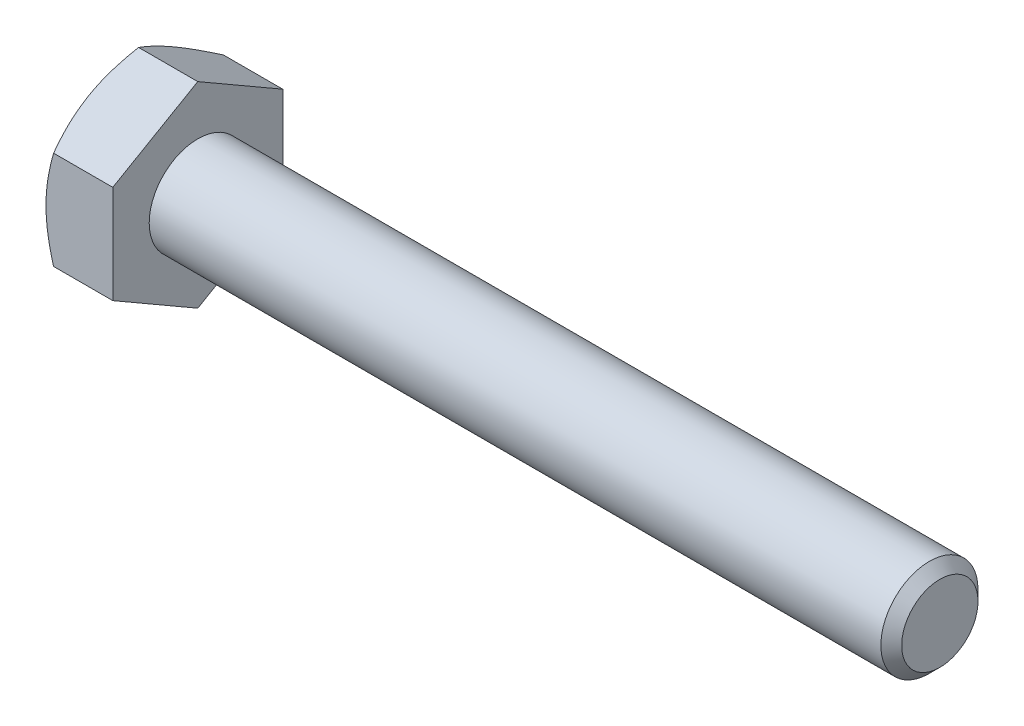
ISO-10303-21;
HEADER;
FILE_DESCRIPTION(('STEP AP214'),'2;1');
FILE_NAME('part.step','',(''),(''),'','','');
FILE_SCHEMA(('AUTOMOTIVE_DESIGN { 1 0 10303 214 1 1 1 1 }'));
ENDSEC;
DATA;
#1=APPLICATION_CONTEXT('core data for automotive mechanical design processes');
#2=APPLICATION_PROTOCOL_DEFINITION('international standard','automotive_design',2000,#1);
#3=PRODUCT_CONTEXT('',#1,'mechanical');
#4=PRODUCT('Part','Part','',(#3));
#5=PRODUCT_RELATED_PRODUCT_CATEGORY('part','',(#4));
#6=PRODUCT_DEFINITION_FORMATION('','',#4);
#7=PRODUCT_DEFINITION_CONTEXT('part definition',#1,'design');
#8=PRODUCT_DEFINITION('design','',#6,#7);
#9=PRODUCT_DEFINITION_SHAPE('','',#8);
#10=(LENGTH_UNIT() NAMED_UNIT(*) SI_UNIT(.MILLI.,.METRE.));
#11=(NAMED_UNIT(*) PLANE_ANGLE_UNIT() SI_UNIT($,.RADIAN.));
#12=(NAMED_UNIT(*) SI_UNIT($,.STERADIAN.) SOLID_ANGLE_UNIT());
#13=UNCERTAINTY_MEASURE_WITH_UNIT(LENGTH_MEASURE(1.E-05),#10,'distance_accuracy_value','');
#14=(GEOMETRIC_REPRESENTATION_CONTEXT(3) GLOBAL_UNCERTAINTY_ASSIGNED_CONTEXT((#13)) GLOBAL_UNIT_ASSIGNED_CONTEXT((#10,
#11,#12)) REPRESENTATION_CONTEXT('',''));
#15=CARTESIAN_POINT('',(0.,0.,0.));
#16=DIRECTION('',(0.,0.,1.));
#17=DIRECTION('',(1.,0.,0.));
#18=AXIS2_PLACEMENT_3D('',#15,#16,#17);
#19=CARTESIAN_POINT('',(-26.4398125,-3.20790243318485,5.55625));
#20=DIRECTION('',(0.,0.,-1.));
#21=DIRECTION('',(0.,1.,0.));
#22=AXIS2_PLACEMENT_3D('',#19,#20,#21);
#23=PLANE('',#22);
#24=CARTESIAN_POINT('',(-23.6663750574616,-8.74399028271723,5.55625));
#25=CARTESIAN_POINT('',(-23.7851476439003,-8.50018624433214,5.55625));
#26=CARTESIAN_POINT('',(-23.9028174877412,-8.25583594838017,5.55625));
#27=CARTESIAN_POINT('',(-24.1353338302931,-7.76575276181023,5.55625));
#28=CARTESIAN_POINT('',(-24.250179907504,-7.5200196714312,5.55625));
#29=CARTESIAN_POINT('',(-24.4769815650906,-7.02567502758554,5.55625));
#30=CARTESIAN_POINT('',(-24.5889190754759,-6.77705515601886,5.55625));
#31=CARTESIAN_POINT('',(-24.8083791438231,-6.2778816135969,5.55625));
#32=CARTESIAN_POINT('',(-24.9159019023311,-6.02732803119864,5.55625));
#33=CARTESIAN_POINT('',(-25.128906896146,-5.51539046667091,5.55625));
#34=CARTESIAN_POINT('',(-25.2341977000269,-5.25392641272659,5.55625));
#35=CARTESIAN_POINT('',(-25.4371139851458,-4.72798657849261,5.55625));
#36=CARTESIAN_POINT('',(-25.5347386244234,-4.46351047103702,5.55625));
#37=CARTESIAN_POINT('',(-25.7198532154484,-3.931581690416,5.55625));
#38=CARTESIAN_POINT('',(-25.8073626154158,-3.66413585057298,5.55625));
#39=CARTESIAN_POINT('',(-25.9695224423586,-3.12540698347401,5.55625));
#40=CARTESIAN_POINT('',(-26.044176786064,-2.85412515234023,5.55625));
#41=CARTESIAN_POINT('',(-26.1767361578849,-2.30908269853905,5.55625));
#42=CARTESIAN_POINT('',(-26.2347346690236,-2.03534517245375,5.55625));
#43=CARTESIAN_POINT('',(-26.3307733322196,-1.48429809984412,5.55625));
#44=CARTESIAN_POINT('',(-26.368815646564,-1.20698894364918,5.55625));
#45=CARTESIAN_POINT('',(-26.4083928026956,-0.791294728945891,5.55625));
#46=CARTESIAN_POINT('',(-26.418658902021,-0.653708209357037,5.55625));
#47=CARTESIAN_POINT('',(-26.433362187288,-0.378228688137559,5.55625));
#48=CARTESIAN_POINT('',(-26.4377999263983,-0.240335716836742,5.55625));
#49=CARTESIAN_POINT('',(-26.4407354775687,0.0355251316508555,5.55625));
#50=CARTESIAN_POINT('',(-26.4392327727923,0.173493014310987,5.55625));
#51=CARTESIAN_POINT('',(-26.4303265100424,0.449228447033503,5.55625));
#52=CARTESIAN_POINT('',(-26.4229231814189,0.586996004673775,5.55625));
#53=CARTESIAN_POINT('',(-26.3984869355163,0.914267817860307,5.55625));
#54=CARTESIAN_POINT('',(-26.3788672237309,1.10358331302688,5.55625));
#55=CARTESIAN_POINT('',(-26.3295268119308,1.48088314390515,5.55625));
#56=CARTESIAN_POINT('',(-26.2998048473206,1.66886730995275,5.55625));
#57=CARTESIAN_POINT('',(-26.1970555513119,2.23056094001761,5.55625));
#58=CARTESIAN_POINT('',(-26.1104606125147,2.60182550045218,5.55625));
#59=CARTESIAN_POINT('',(-25.9593261053987,3.1572572910348,5.55625));
#60=CARTESIAN_POINT('',(-25.9046586113424,3.34427702524158,5.55625));
#61=CARTESIAN_POINT('',(-25.789406052333,3.71650215163137,5.55625));
#62=CARTESIAN_POINT('',(-25.7288209419117,3.90170752986172,5.55625));
#63=CARTESIAN_POINT('',(-25.6027250457604,4.27035971442928,5.55625));
#64=CARTESIAN_POINT('',(-25.5372156550753,4.45380700235123,5.55625));
#65=CARTESIAN_POINT('',(-25.4020659129719,4.81916376783227,5.55625));
#66=CARTESIAN_POINT('',(-25.3324256552842,5.00107328017708,5.55625));
#67=CARTESIAN_POINT('',(-25.1400333948252,5.48965634412822,5.55625));
#68=CARTESIAN_POINT('',(-25.0140472750788,5.79505516029649,5.55625));
#69=CARTESIAN_POINT('',(-24.7546962832958,6.40271511827116,5.55625));
#70=CARTESIAN_POINT('',(-24.6213305993156,6.7049759104509,5.55625));
#71=CARTESIAN_POINT('',(-24.3489631126131,7.30707795631466,5.55625));
#72=CARTESIAN_POINT('',(-24.2099591769931,7.60691824193362,5.55625));
#73=CARTESIAN_POINT('',(-23.9276603632321,8.20455030388994,5.55625));
#74=CARTESIAN_POINT('',(-23.7843656584325,8.50234216238502,5.55625));
#75=CARTESIAN_POINT('',(-23.494187083384,9.09675870347432,5.55625));
#76=CARTESIAN_POINT('',(-23.3472978378226,9.39338075659061,5.55625));
#77=CARTESIAN_POINT('',(-23.0508414750758,9.98528417706332,5.55625));
#78=CARTESIAN_POINT('',(-22.9012743357868,10.2805655333282,5.55625));
#79=CARTESIAN_POINT('',(-22.4494394244542,11.1646418998589,5.55625));
#80=CARTESIAN_POINT('',(-22.1439729994491,11.7518013892495,5.55625));
#81=CARTESIAN_POINT('',(-21.5598679574184,12.8613257589912,5.55625));
#82=CARTESIAN_POINT('',(-21.2817985829024,13.3839917749348,5.55625));
#83=CARTESIAN_POINT('',(-20.7223014266466,14.4275635287064,5.55625));
#84=CARTESIAN_POINT('',(-20.4408734397934,14.9484691565073,5.55625));
#85=CARTESIAN_POINT('',(-19.8764769924016,15.9871873035495,5.55625));
#86=CARTESIAN_POINT('',(-19.5935168337456,16.5050043408021,5.55625));
#87=CARTESIAN_POINT('',(-19.0256898642822,17.5395393833806,5.55625));
#88=CARTESIAN_POINT('',(-18.7408232052305,18.0562574719669,5.55625));
#89=CARTESIAN_POINT('',(-18.45526235051,18.5725892213169,5.55625));
#90=B_SPLINE_CURVE_WITH_KNOTS('',3,(#24,#25,#26,#27,#28,#29,#30,#31,#32,#33,#34,#35,#36,#37,#38,
#39,#40,#41,#42,#43,#44,#45,#46,#47,#48,#49,#50,#51,#52,#53,#54,#55,#56,#57,#58,#59,#60,#61,#62,
#63,#64,#65,#66,#67,#68,#69,#70,#71,#72,#73,#74,#75,#76,#77,#78,#79,#80,#81,#82,#83,#84,#85,#86,
#87,#88,#89),.UNSPECIFIED.,.F.,.F.,(4,2,2,2,2,2,2,2,2,2,2,2,2,2,2,2,2,2,2,2,2,2,2,2,2,2,2,2,2,2,
2,2,4),(0.,0.813597716445731,1.6273161491936,2.44525275827226,3.26315217028693,4.10866348233596,
4.95426752580812,5.79821771718855,6.64191031370899,7.48077064504382,8.31954006567861,
8.73334238532055,9.14710542821065,9.56090447051724,9.97468742974186,10.545356138106,
11.1160963088496,12.258134229421,12.842619474887,13.4271092116055,14.0114339823823,
14.5957454997084,15.5866951993033,16.5777541467498,17.5691915643883,18.5605889831377,
19.5535724737812,20.5465641644216,22.5321054869692,24.3081902186865,26.0843839782317,
27.8546363211013,29.6247493906644),.UNSPECIFIED.);
#91=CARTESIAN_POINT('',(-25.9435482665182,-3.20790243318485,5.55625));
#92=VERTEX_POINT('',#91);
#93=CARTESIAN_POINT('',(-26.4398125,0.,5.55625));
#94=VERTEX_POINT('',#93);
#95=EDGE_CURVE('E284',#92,#94,#90,.T.);
#96=ORIENTED_EDGE('',*,*,#95,.F.);
#97=DIRECTION('',(1.,0.,0.));
#98=VECTOR('',#97,1.);
#99=CARTESIAN_POINT('',(-26.4398125,-3.20790243318485,5.55625));
#100=LINE('',#99,#98);
#101=CARTESIAN_POINT('',(-22.0741875,-3.20790243318485,5.55625));
#102=VERTEX_POINT('',#101);
#103=EDGE_CURVE('E287',#92,#102,#100,.T.);
#104=ORIENTED_EDGE('',*,*,#103,.T.);
#105=DIRECTION('',(0.,1.,0.));
#106=VECTOR('',#105,1.);
#107=CARTESIAN_POINT('',(-22.0741875,-3.20790243318485,5.55625));
#108=LINE('',#107,#106);
#109=CARTESIAN_POINT('',(-22.0741875,3.20790243318486,5.55625));
#110=VERTEX_POINT('',#109);
#111=EDGE_CURVE('E290',#102,#110,#108,.T.);
#112=ORIENTED_EDGE('',*,*,#111,.T.);
#113=DIRECTION('',(1.,0.,0.));
#114=VECTOR('',#113,1.);
#115=CARTESIAN_POINT('',(-26.4398125,3.20790243318486,5.55625));
#116=LINE('',#115,#114);
#117=CARTESIAN_POINT('',(-25.9435482665182,3.20790243318486,5.55625));
#118=VERTEX_POINT('',#117);
#119=EDGE_CURVE('E246',#118,#110,#116,.T.);
#120=ORIENTED_EDGE('',*,*,#119,.F.);
#121=EDGE_CURVE('E123',#94,#118,#90,.T.);
#122=ORIENTED_EDGE('',*,*,#121,.F.);
#123=EDGE_LOOP('',(#96,#104,#112,#120,#122));
#124=FACE_BOUND('',#123,.T.);
#125=ADVANCED_FACE('F46',(#124),#23,.F.);
#126=CARTESIAN_POINT('',(-26.4398125,3.20790243318486,5.55625));
#127=DIRECTION('',(0.,-0.866025403784439,-0.5));
#128=DIRECTION('',(0.,0.5,-0.866025403784439));
#129=AXIS2_PLACEMENT_3D('',#126,#127,#128);
#130=PLANE('',#129);
#131=CARTESIAN_POINT('',(-25.9434815980518,3.20778696313102,5.55645));
#132=CARTESIAN_POINT('',(-25.9841869396287,3.27830048099899,5.43431700443227));
#133=CARTESIAN_POINT('',(-26.0230449606368,3.34907690760433,5.31172863757365));
#134=CARTESIAN_POINT('',(-26.0965575665754,3.49120454378004,5.06555635055764));
#135=CARTESIAN_POINT('',(-26.1312103381981,3.56255598725623,4.94197202526351));
#136=CARTESIAN_POINT('',(-26.2281806144389,3.7777527611819,4.56924027919934));
#137=CARTESIAN_POINT('',(-26.283336445498,3.92244755263586,4.3186215488105));
#138=CARTESIAN_POINT('',(-26.348013595153,4.13898067940738,3.94357517172046));
#139=CARTESIAN_POINT('',(-26.3664383296374,4.21017202280889,3.82026814788997));
#140=CARTESIAN_POINT('',(-26.3973341337596,4.35287639627881,3.57309692257778));
#141=CARTESIAN_POINT('',(-26.409805729438,4.42438939736052,3.44923277130254));
#142=CARTESIAN_POINT('',(-26.4284774134017,4.56753961185542,3.20128932668298));
#143=CARTESIAN_POINT('',(-26.4346846193166,4.63917659144933,3.07721043832556));
#144=CARTESIAN_POINT('',(-26.4407010825862,4.7825127822332,2.82894487332451));
#145=CARTESIAN_POINT('',(-26.4405105375727,4.85421199143242,2.70475820012895));
#146=CARTESIAN_POINT('',(-26.4311942573071,5.05064720059278,2.36452243746779));
#147=CARTESIAN_POINT('',(-26.4155528403106,5.1753189069971,2.14858470770919));
#148=CARTESIAN_POINT('',(-26.3659525950254,5.42383425573453,1.71814349723526));
#149=CARTESIAN_POINT('',(-26.3319768117333,5.54767702400135,1.50364153044716));
#150=CARTESIAN_POINT('',(-26.2470467499519,5.7966925582286,1.07233397329164));
#151=CARTESIAN_POINT('',(-26.1957326119579,5.92183390122649,0.855582809091896));
#152=CARTESIAN_POINT('',(-26.0792700447076,6.17025031750736,0.425312954659246));
#153=CARTESIAN_POINT('',(-26.0141489741206,6.29352857247572,0.21178875358562));
#154=CARTESIAN_POINT('',(-25.9434815980518,6.41592033642355,-0.000200000000001332));
#155=B_SPLINE_CURVE_WITH_KNOTS('',3,(#131,#132,#133,#134,#135,#136,#137,#138,#139,#140,#141,
#142,#143,#144,#145,#146,#147,#148,#149,#150,#151,#152,#153,#154),.UNSPECIFIED.,.F.,.F.,(4,2,2,
2,2,2,2,2,2,2,2,4),(0.,0.440316908268041,0.880823012040825,1.76366572331169,2.19427472390783,
2.62484566732156,3.05492684132792,3.4849947297767,4.23370964386675,4.98311813377593,
5.74914806559356,6.51367405016872),.UNSPECIFIED.);
#156=CARTESIAN_POINT('',(-26.4398125,4.81185364977729,2.778125));
#157=VERTEX_POINT('',#156);
#158=EDGE_CURVE('E119',#118,#157,#155,.T.);
#159=ORIENTED_EDGE('',*,*,#158,.F.);
#160=ORIENTED_EDGE('',*,*,#119,.T.);
#161=DIRECTION('',(0.,0.5,-0.866025403784439));
#162=VECTOR('',#161,1.);
#163=CARTESIAN_POINT('',(-22.0741875,3.20790243318486,5.55625));
#164=LINE('',#163,#162);
#165=CARTESIAN_POINT('',(-22.0741875,6.41580486636971,0.));
#166=VERTEX_POINT('',#165);
#167=EDGE_CURVE('E314',#110,#166,#164,.T.);
#168=ORIENTED_EDGE('',*,*,#167,.T.);
#169=DIRECTION('',(1.,0.,0.));
#170=VECTOR('',#169,1.);
#171=CARTESIAN_POINT('',(-26.4398125,6.41580486636971,0.));
#172=LINE('',#171,#170);
#173=CARTESIAN_POINT('',(-25.9435482665182,6.41580486636971,0.));
#174=VERTEX_POINT('',#173);
#175=EDGE_CURVE('E144',#174,#166,#172,.T.);
#176=ORIENTED_EDGE('',*,*,#175,.F.);
#177=EDGE_CURVE('E128',#157,#174,#155,.T.);
#178=ORIENTED_EDGE('',*,*,#177,.F.);
#179=EDGE_LOOP('',(#159,#160,#168,#176,#178));
#180=FACE_BOUND('',#179,.T.);
#181=ADVANCED_FACE('F142',(#180),#130,.F.);
#182=CARTESIAN_POINT('',(-26.4398125,6.41580486636971,0.));
#183=DIRECTION('',(0.,-0.866025403784439,0.5));
#184=DIRECTION('',(0.,-0.5,-0.866025403784439));
#185=AXIS2_PLACEMENT_3D('',#182,#183,#184);
#186=PLANE('',#185);
#187=CARTESIAN_POINT('',(-25.9434815980518,6.41592033642355,0.000199999999998423));
#188=CARTESIAN_POINT('',(-25.9841869396287,6.34540681855559,-0.121932995567732));
#189=CARTESIAN_POINT('',(-26.0230449606368,6.27463039195025,-0.244521362426354));
#190=CARTESIAN_POINT('',(-26.0965575665754,6.13250275577453,-0.490693649442358));
#191=CARTESIAN_POINT('',(-26.1312103381981,6.06115131229835,-0.614277974736489));
#192=CARTESIAN_POINT('',(-26.2281806144389,5.84595453837268,-0.987009720800664));
#193=CARTESIAN_POINT('',(-26.283336445498,5.70125974691872,-1.2376284511895));
#194=CARTESIAN_POINT('',(-26.348013595153,5.48472662014719,-1.61267482827954));
#195=CARTESIAN_POINT('',(-26.3664383296374,5.41353527674569,-1.73598185211002));
#196=CARTESIAN_POINT('',(-26.3973341337596,5.27083090327576,-1.98315307742222));
#197=CARTESIAN_POINT('',(-26.409805729438,5.19931790219406,-2.10701722869746));
#198=CARTESIAN_POINT('',(-26.4284774134017,5.05616768769915,-2.35496067331702));
#199=CARTESIAN_POINT('',(-26.4346846193166,4.98453070810525,-2.47903956167444));
#200=CARTESIAN_POINT('',(-26.4407010825862,4.84119451732138,-2.72730512667549));
#201=CARTESIAN_POINT('',(-26.4405105375727,4.76949530812215,-2.85149179987105));
#202=CARTESIAN_POINT('',(-26.4311942573071,4.5730600989618,-3.19172756253221));
#203=CARTESIAN_POINT('',(-26.4155528403106,4.44838839255747,-3.40766529229081));
#204=CARTESIAN_POINT('',(-26.3659525950254,4.19987304382004,-3.83810650276474));
#205=CARTESIAN_POINT('',(-26.3319768117333,4.07603027555323,-4.05260846955284));
#206=CARTESIAN_POINT('',(-26.2470467499519,3.82701474132597,-4.48391602670836));
#207=CARTESIAN_POINT('',(-26.1957326119579,3.70187339832808,-4.7006671909081));
#208=CARTESIAN_POINT('',(-26.0792700447076,3.45345698204721,-5.13093704534075));
#209=CARTESIAN_POINT('',(-26.0141489741206,3.33017872707885,-5.34446124641437));
#210=CARTESIAN_POINT('',(-25.9434815980518,3.20778696313102,-5.55645));
#211=B_SPLINE_CURVE_WITH_KNOTS('',3,(#187,#188,#189,#190,#191,#192,#193,#194,#195,#196,#197,
#198,#199,#200,#201,#202,#203,#204,#205,#206,#207,#208,#209,#210),.UNSPECIFIED.,.F.,.F.,(4,2,2,
2,2,2,2,2,2,2,2,4),(0.,0.440316908268041,0.880823012040823,1.76366572331169,2.19427472390783,
2.62484566732156,3.05492684132792,3.48499472977669,4.23370964386674,4.98311813377593,
5.74914806559356,6.51367405016872),.UNSPECIFIED.);
#212=CARTESIAN_POINT('',(-26.4398125,4.81185364977729,-2.778125));
#213=VERTEX_POINT('',#212);
#214=EDGE_CURVE('E133',#174,#213,#211,.T.);
#215=ORIENTED_EDGE('',*,*,#214,.F.);
#216=ORIENTED_EDGE('',*,*,#175,.T.);
#217=DIRECTION('',(0.,-0.5,-0.866025403784439));
#218=VECTOR('',#217,1.);
#219=CARTESIAN_POINT('',(-22.0741875,6.41580486636971,0.));
#220=LINE('',#219,#218);
#221=CARTESIAN_POINT('',(-22.0741875,3.20790243318486,-5.55625));
#222=VERTEX_POINT('',#221);
#223=EDGE_CURVE('E311',#166,#222,#220,.T.);
#224=ORIENTED_EDGE('',*,*,#223,.T.);
#225=DIRECTION('',(1.,0.,0.));
#226=VECTOR('',#225,1.);
#227=CARTESIAN_POINT('',(-26.4398125,3.20790243318486,-5.55625));
#228=LINE('',#227,#226);
#229=CARTESIAN_POINT('',(-25.9435482665182,3.20790243318486,-5.55625));
#230=VERTEX_POINT('',#229);
#231=EDGE_CURVE('E306',#230,#222,#228,.T.);
#232=ORIENTED_EDGE('',*,*,#231,.F.);
#233=EDGE_CURVE('E147',#213,#230,#211,.T.);
#234=ORIENTED_EDGE('',*,*,#233,.F.);
#235=EDGE_LOOP('',(#215,#216,#224,#232,#234));
#236=FACE_BOUND('',#235,.T.);
#237=ADVANCED_FACE('F208',(#236),#186,.F.);
#238=CARTESIAN_POINT('',(-26.4398125,3.20790243318486,-5.55625));
#239=DIRECTION('',(0.,0.,1.));
#240=DIRECTION('',(0.,-1.,0.));
#241=AXIS2_PLACEMENT_3D('',#238,#239,#240);
#242=PLANE('',#241);
#243=CARTESIAN_POINT('',(-23.6663750598475,-8.74399027782085,-5.55624999999999));
#244=CARTESIAN_POINT('',(-23.7851476461868,-8.50018623960062,-5.55624999999999));
#245=CARTESIAN_POINT('',(-23.9028174899284,-8.25583594381362,-5.55624999999999));
#246=CARTESIAN_POINT('',(-24.135333832282,-7.76575275757412,-5.55624999999999));
#247=CARTESIAN_POINT('',(-24.250179909394,-7.52001966736056,-5.55624999999999));
#248=CARTESIAN_POINT('',(-24.4769815667827,-7.02567502384834,-5.55624999999999));
#249=CARTESIAN_POINT('',(-24.5889190770691,-6.77705515244963,-5.55624999999999));
#250=CARTESIAN_POINT('',(-24.8083791452201,-6.27788161036475,-5.55624999999999));
#251=CARTESIAN_POINT('',(-24.9159019036307,-6.02732802813558,-5.55624999999999));
#252=CARTESIAN_POINT('',(-25.1289068972481,-5.51539046395942,-5.55624999999999));
#253=CARTESIAN_POINT('',(-25.234197701029,-5.25392641019769,-5.55624999999999));
#254=CARTESIAN_POINT('',(-25.4371139859531,-4.72798657633179,-5.55624999999999));
#255=CARTESIAN_POINT('',(-25.5347386251359,-4.46351046906169,-5.55624999999999));
#256=CARTESIAN_POINT('',(-25.7198532159805,-3.93158168881508,-5.55624999999999));
#257=CARTESIAN_POINT('',(-25.8073626158621,-3.66413584916098,-5.55624999999999));
#258=CARTESIAN_POINT('',(-25.9695224426472,-3.12540698244495,-5.55624999999999));
#259=CARTESIAN_POINT('',(-26.0441767862806,-2.8541251515052,-5.55624999999999));
#260=CARTESIAN_POINT('',(-26.1767361579561,-2.30908269819076,-5.55624999999999));
#261=CARTESIAN_POINT('',(-26.2347346690269,-2.03534517239951,-5.55624999999999));
#262=CARTESIAN_POINT('',(-26.3307733321313,-1.4842981003853,-5.55624999999999));
#263=CARTESIAN_POINT('',(-26.3688156464521,-1.20698894449172,-5.55625));
#264=CARTESIAN_POINT('',(-26.4083928025883,-0.791294730238443,-5.55625));
#265=CARTESIAN_POINT('',(-26.4186589019217,-0.653708210797408,-5.55625));
#266=CARTESIAN_POINT('',(-26.4333621872177,-0.378228689873304,-5.55625));
#267=CARTESIAN_POINT('',(-26.4377999263492,-0.24033571872004,-5.55625));
#268=CARTESIAN_POINT('',(-26.4407354775746,0.0355251294734929,-5.55625));
#269=CARTESIAN_POINT('',(-26.4392327728321,0.173493011987113,-5.55625));
#270=CARTESIAN_POINT('',(-26.430326510162,0.449228444418532,-5.55625));
#271=CARTESIAN_POINT('',(-26.4229231815845,0.586996001914217,-5.55625));
#272=CARTESIAN_POINT('',(-26.3984869357947,0.914267814878998,-5.55625));
#273=CARTESIAN_POINT('',(-26.3788672240741,1.10358330996903,-5.55625));
#274=CARTESIAN_POINT('',(-26.329526812407,1.48088314069774,-5.55625));
#275=CARTESIAN_POINT('',(-26.2998048478651,1.66886730667231,-5.55625));
#276=CARTESIAN_POINT('',(-26.1970555520625,2.23056093652212,-5.55625));
#277=CARTESIAN_POINT('',(-26.1104606134045,2.60182549681905,-5.55625));
#278=CARTESIAN_POINT('',(-25.9593261064939,3.15725728719582,-5.55625));
#279=CARTESIAN_POINT('',(-25.9046586125065,3.34427702133249,-5.55625));
#280=CARTESIAN_POINT('',(-25.7894060536328,3.71650214758286,-5.55625));
#281=CARTESIAN_POINT('',(-25.7288209432783,3.9017075257439,-5.55625));
#282=CARTESIAN_POINT('',(-25.6027250472581,4.27035971017337,-5.55625));
#283=CARTESIAN_POINT('',(-25.5372156566373,4.45380699802653,-5.55625));
#284=CARTESIAN_POINT('',(-25.4020659146602,4.81916376337001,-5.55625));
#285=CARTESIAN_POINT('',(-25.3324256570347,5.00107327564603,-5.55625));
#286=CARTESIAN_POINT('',(-25.1400333966823,5.48965633955827,-5.55625));
#287=CARTESIAN_POINT('',(-25.0140472769738,5.7950551557544,-5.55625));
#288=CARTESIAN_POINT('',(-24.7546962852557,6.4027151137812,-5.55625));
#289=CARTESIAN_POINT('',(-24.6213306013023,6.7049759059852,-5.55625));
#290=CARTESIAN_POINT('',(-24.3489631146457,7.3070779518949,-5.55625));
#291=CARTESIAN_POINT('',(-24.2099591790448,7.60691823753553,-5.55625));
#292=CARTESIAN_POINT('',(-23.9276603653161,8.20455029953285,-5.55625));
#293=CARTESIAN_POINT('',(-23.7843656605298,8.50234215804726,-5.55625));
#294=CARTESIAN_POINT('',(-23.4941870855033,9.09675869917466,-5.55625));
#295=CARTESIAN_POINT('',(-23.3472978399505,9.3933807523097,-5.55625));
#296=CARTESIAN_POINT('',(-23.050841477218,9.9852841728185,-5.55625));
#297=CARTESIAN_POINT('',(-22.9012743379345,10.2805655291007,-5.55625));
#298=CARTESIAN_POINT('',(-22.4494394266152,11.1646418956815,-5.55625));
#299=CARTESIAN_POINT('',(-22.1439730016145,11.7518013851031,-5.55625));
#300=CARTESIAN_POINT('',(-21.5598679596005,12.8613257548756,-5.55625));
#301=CARTESIAN_POINT('',(-21.2817985850975,13.3839917708193,-5.55625));
#302=CARTESIAN_POINT('',(-20.722301428865,14.42756352459,-5.55625));
#303=CARTESIAN_POINT('',(-20.4408734420222,14.9484691523898,-5.55625));
#304=CARTESIAN_POINT('',(-19.8764769946515,15.9871872994245,-5.55625));
#305=CARTESIAN_POINT('',(-19.5935168360065,16.5050043366708,-5.55625));
#306=CARTESIAN_POINT('',(-19.0256898665637,17.5395393792358,-5.55625));
#307=CARTESIAN_POINT('',(-18.7408232075218,18.056257467815,-5.55625));
#308=CARTESIAN_POINT('',(-18.4552623528106,18.5725892171576,-5.55625));
#309=B_SPLINE_CURVE_WITH_KNOTS('',3,(#243,#244,#245,#246,#247,#248,#249,#250,#251,#252,#253,
#254,#255,#256,#257,#258,#259,#260,#261,#262,#263,#264,#265,#266,#267,#268,#269,#270,#271,#272,
#273,#274,#275,#276,#277,#278,#279,#280,#281,#282,#283,#284,#285,#286,#287,#288,#289,#290,#291,
#292,#293,#294,#295,#296,#297,#298,#299,#300,#301,#302,#303,#304,#305,#306,#307,#308),
.UNSPECIFIED.,.F.,.F.,(4,2,2,2,2,2,2,2,2,2,2,2,2,2,2,2,2,2,2,2,2,2,2,2,2,2,2,2,2,2,2,2,4),(0.,
0.813597715870461,1.62731614804298,2.44525275654031,3.26315216797368,4.10866347940256,
4.95426752225437,5.79821771301645,6.64191030891902,7.48077063935046,8.31954005908317,
8.73334237828505,9.14710542073519,9.56090446260156,9.97468742138602,10.5453561295019,
11.1160962999972,12.2581342200709,12.8426194652768,13.4271092017353,14.0114339722529,
14.5957454893196,15.5866951889479,16.5777541364282,17.5691915541016,18.5605889728859,
19.5535724635683,20.5465641542476,22.5321054768716,24.308190208571,26.0843839680985,
27.8546363109357,29.624749380466),.UNSPECIFIED.);
#310=CARTESIAN_POINT('',(-26.4398125,0.,-5.55625));
#311=VERTEX_POINT('',#310);
#312=EDGE_CURVE('E202',#230,#311,#309,.F.);
#313=ORIENTED_EDGE('',*,*,#312,.F.);
#314=ORIENTED_EDGE('',*,*,#231,.T.);
#315=DIRECTION('',(0.,-1.,0.));
#316=VECTOR('',#315,1.);
#317=CARTESIAN_POINT('',(-22.0741875,3.20790243318486,-5.55625));
#318=LINE('',#317,#316);
#319=CARTESIAN_POINT('',(-22.0741875,-3.20790243318486,-5.55624999999999));
#320=VERTEX_POINT('',#319);
#321=EDGE_CURVE('E319',#222,#320,#318,.T.);
#322=ORIENTED_EDGE('',*,*,#321,.T.);
#323=DIRECTION('',(1.,0.,0.));
#324=VECTOR('',#323,1.);
#325=CARTESIAN_POINT('',(-26.4398125,-3.20790243318486,-5.55624999999999));
#326=LINE('',#325,#324);
#327=CARTESIAN_POINT('',(-25.9435482665182,-3.20790243318486,-5.55624999999999));
#328=VERTEX_POINT('',#327);
#329=EDGE_CURVE('E268',#328,#320,#326,.T.);
#330=ORIENTED_EDGE('',*,*,#329,.F.);
#331=EDGE_CURVE('E195',#311,#328,#309,.F.);
#332=ORIENTED_EDGE('',*,*,#331,.F.);
#333=EDGE_LOOP('',(#313,#314,#322,#330,#332));
#334=FACE_BOUND('',#333,.T.);
#335=ADVANCED_FACE('F204',(#334),#242,.F.);
#336=CARTESIAN_POINT('',(-26.4398125,-3.20790243318486,-5.55624999999999));
#337=DIRECTION('',(0.,0.866025403784439,0.5));
#338=DIRECTION('',(0.,-0.5,0.866025403784439));
#339=AXIS2_PLACEMENT_3D('',#336,#337,#338);
#340=PLANE('',#339);
#341=CARTESIAN_POINT('',(-25.9434815980518,-3.20778696313102,-5.55644999999999));
#342=CARTESIAN_POINT('',(-25.9841869396287,-3.27830048099898,-5.43431700443226));
#343=CARTESIAN_POINT('',(-26.0230449606368,-3.34907690760433,-5.31172863757364));
#344=CARTESIAN_POINT('',(-26.0965575665754,-3.49120454378004,-5.06555635055764));
#345=CARTESIAN_POINT('',(-26.1312103381981,-3.56255598725622,-4.94197202526351));
#346=CARTESIAN_POINT('',(-26.2281806144389,-3.77775276118189,-4.56924027919933));
#347=CARTESIAN_POINT('',(-26.283336445498,-3.92244755263585,-4.31862154881049));
#348=CARTESIAN_POINT('',(-26.348013595153,-4.13898067940738,-3.94357517172046));
#349=CARTESIAN_POINT('',(-26.3664383296374,-4.21017202280888,-3.82026814788997));
#350=CARTESIAN_POINT('',(-26.3973341337596,-4.35287639627881,-3.57309692257778));
#351=CARTESIAN_POINT('',(-26.409805729438,-4.42438939736051,-3.44923277130253));
#352=CARTESIAN_POINT('',(-26.4284774134017,-4.56753961185542,-3.20128932668298));
#353=CARTESIAN_POINT('',(-26.4346846193166,-4.63917659144932,-3.07721043832556));
#354=CARTESIAN_POINT('',(-26.4407010825862,-4.7825127822332,-2.82894487332451));
#355=CARTESIAN_POINT('',(-26.4405105375727,-4.85421199143242,-2.70475820012895));
#356=CARTESIAN_POINT('',(-26.4311942573071,-5.05064720059277,-2.36452243746779));
#357=CARTESIAN_POINT('',(-26.4155528403106,-5.1753189069971,-2.14858470770919));
#358=CARTESIAN_POINT('',(-26.3659525950254,-5.42383425573453,-1.71814349723526));
#359=CARTESIAN_POINT('',(-26.3319768117333,-5.54767702400134,-1.50364153044716));
#360=CARTESIAN_POINT('',(-26.2470467499519,-5.7966925582286,-1.07233397329164));
#361=CARTESIAN_POINT('',(-26.1957326119579,-5.92183390122649,-0.855582809091897));
#362=CARTESIAN_POINT('',(-26.0792700447076,-6.17025031750736,-0.425312954659247));
#363=CARTESIAN_POINT('',(-26.0141489741206,-6.29352857247572,-0.21178875358562));
#364=CARTESIAN_POINT('',(-25.9434815980518,-6.41592033642355,0.000200000000000132));
#365=B_SPLINE_CURVE_WITH_KNOTS('',3,(#341,#342,#343,#344,#345,#346,#347,#348,#349,#350,#351,
#352,#353,#354,#355,#356,#357,#358,#359,#360,#361,#362,#363,#364),.UNSPECIFIED.,.F.,.F.,(4,2,2,
2,2,2,2,2,2,2,2,4),(0.,0.440316908268041,0.880823012040822,1.76366572331169,2.19427472390783,
2.62484566732156,3.05492684132792,3.48499472977669,4.23370964386674,4.98311813377593,
5.74914806559356,6.51367405016872),.UNSPECIFIED.);
#366=CARTESIAN_POINT('',(-26.4398125,-4.81185364977729,-2.778125));
#367=VERTEX_POINT('',#366);
#368=EDGE_CURVE('E203',#328,#367,#365,.T.);
#369=ORIENTED_EDGE('',*,*,#368,.F.);
#370=ORIENTED_EDGE('',*,*,#329,.T.);
#371=DIRECTION('',(0.,-0.5,0.866025403784439));
#372=VECTOR('',#371,1.);
#373=CARTESIAN_POINT('',(-22.0741875,-3.20790243318486,-5.55624999999999));
#374=LINE('',#373,#372);
#375=CARTESIAN_POINT('',(-22.0741875,-6.41580486636971,0.));
#376=VERTEX_POINT('',#375);
#377=EDGE_CURVE('E300',#320,#376,#374,.T.);
#378=ORIENTED_EDGE('',*,*,#377,.T.);
#379=DIRECTION('',(1.,0.,0.));
#380=VECTOR('',#379,1.);
#381=CARTESIAN_POINT('',(-26.4398125,-6.41580486636971,0.));
#382=LINE('',#381,#380);
#383=CARTESIAN_POINT('',(-25.9435482665182,-6.41580486636971,0.));
#384=VERTEX_POINT('',#383);
#385=EDGE_CURVE('E295',#384,#376,#382,.T.);
#386=ORIENTED_EDGE('',*,*,#385,.F.);
#387=EDGE_CURVE('E189',#367,#384,#365,.T.);
#388=ORIENTED_EDGE('',*,*,#387,.F.);
#389=EDGE_LOOP('',(#369,#370,#378,#386,#388));
#390=FACE_BOUND('',#389,.T.);
#391=ADVANCED_FACE('F207',(#390),#340,.F.);
#392=CARTESIAN_POINT('',(-26.4398125,-6.41580486636971,0.));
#393=DIRECTION('',(0.,0.866025403784439,-0.5));
#394=DIRECTION('',(0.,0.5,0.866025403784439));
#395=AXIS2_PLACEMENT_3D('',#392,#393,#394);
#396=PLANE('',#395);
#397=CARTESIAN_POINT('',(-25.9434815980518,-6.41592033642355,-0.000200000000000443));
#398=CARTESIAN_POINT('',(-25.9841869396287,-6.34540681855558,0.12193299556773));
#399=CARTESIAN_POINT('',(-26.0230449606368,-6.27463039195024,0.244521362426352));
#400=CARTESIAN_POINT('',(-26.0965575665754,-6.13250275577453,0.490693649442355));
#401=CARTESIAN_POINT('',(-26.1312103381981,-6.06115131229834,0.614277974736486));
#402=CARTESIAN_POINT('',(-26.2281806144389,-5.84595453837267,0.987009720800661));
#403=CARTESIAN_POINT('',(-26.283336445498,-5.70125974691871,1.2376284511895));
#404=CARTESIAN_POINT('',(-26.348013595153,-5.48472662014719,1.61267482827954));
#405=CARTESIAN_POINT('',(-26.3664383296374,-5.41353527674569,1.73598185211002));
#406=CARTESIAN_POINT('',(-26.3973341337596,-5.27083090327576,1.98315307742221));
#407=CARTESIAN_POINT('',(-26.409805729438,-5.19931790219405,2.10701722869746));
#408=CARTESIAN_POINT('',(-26.4284774134017,-5.05616768769915,2.35496067331701));
#409=CARTESIAN_POINT('',(-26.4346846193166,-4.98453070810524,2.47903956167444));
#410=CARTESIAN_POINT('',(-26.4407010825862,-4.84119451732137,2.72730512667549));
#411=CARTESIAN_POINT('',(-26.4405105375727,-4.76949530812215,2.85149179987105));
#412=CARTESIAN_POINT('',(-26.4311942573071,-4.5730600989618,3.1917275625322));
#413=CARTESIAN_POINT('',(-26.4155528403106,-4.44838839255747,3.40766529229081));
#414=CARTESIAN_POINT('',(-26.3659525950254,-4.19987304382004,3.83810650276474));
#415=CARTESIAN_POINT('',(-26.3319768117333,-4.07603027555322,4.05260846955284));
#416=CARTESIAN_POINT('',(-26.2470467499519,-3.82701474132596,4.48391602670836));
#417=CARTESIAN_POINT('',(-26.1957326119579,-3.70187339832808,4.7006671909081));
#418=CARTESIAN_POINT('',(-26.0792700447076,-3.4534569820472,5.13093704534075));
#419=CARTESIAN_POINT('',(-26.0141489741206,-3.33017872707885,5.34446124641438));
#420=CARTESIAN_POINT('',(-25.9434815980518,-3.20778696313101,5.55645));
#421=B_SPLINE_CURVE_WITH_KNOTS('',3,(#397,#398,#399,#400,#401,#402,#403,#404,#405,#406,#407,
#408,#409,#410,#411,#412,#413,#414,#415,#416,#417,#418,#419,#420),.UNSPECIFIED.,.F.,.F.,(4,2,2,
2,2,2,2,2,2,2,2,4),(0.,0.44031690826804,0.880823012040822,1.76366572331169,2.19427472390783,
2.62484566732156,3.05492684132792,3.48499472977669,4.23370964386674,4.98311813377593,
5.74914806559357,6.51367405016873),.UNSPECIFIED.);
#422=CARTESIAN_POINT('',(-26.4398125,-4.81185364977728,2.778125));
#423=VERTEX_POINT('',#422);
#424=EDGE_CURVE('E277',#384,#423,#421,.T.);
#425=ORIENTED_EDGE('',*,*,#424,.F.);
#426=ORIENTED_EDGE('',*,*,#385,.T.);
#427=DIRECTION('',(0.,0.5,0.866025403784439));
#428=VECTOR('',#427,1.);
#429=CARTESIAN_POINT('',(-22.0741875,-6.41580486636971,0.));
#430=LINE('',#429,#428);
#431=EDGE_CURVE('E292',#376,#102,#430,.T.);
#432=ORIENTED_EDGE('',*,*,#431,.T.);
#433=ORIENTED_EDGE('',*,*,#103,.F.);
#434=EDGE_CURVE('E139',#423,#92,#421,.T.);
#435=ORIENTED_EDGE('',*,*,#434,.F.);
#436=EDGE_LOOP('',(#425,#426,#432,#433,#435));
#437=FACE_BOUND('',#436,.T.);
#438=ADVANCED_FACE('F230',(#437),#396,.F.);
#439=CARTESIAN_POINT('',(-22.0741875,0.,0.));
#440=DIRECTION('',(1.,0.,0.));
#441=DIRECTION('',(0.,0.,-1.));
#442=AXIS2_PLACEMENT_3D('',#439,#440,#441);
#443=CYLINDRICAL_SURFACE('',#442,3.175);
#444=CARTESIAN_POINT('',(25.7594553571483,0.,0.));
#445=DIRECTION('',(1.,0.,0.));
#446=DIRECTION('',(0.,0.,-1.));
#447=AXIS2_PLACEMENT_3D('',#444,#445,#446);
#448=CIRCLE('',#447,3.175);
#449=CARTESIAN_POINT('',(25.7594553571483,0.,-3.175));
#450=VERTEX_POINT('',#449);
#451=EDGE_CURVE('E239',#450,#450,#448,.F.);
#452=ORIENTED_EDGE('',*,*,#451,.T.);
#453=EDGE_LOOP('',(#452));
#454=FACE_BOUND('',#453,.T.);
#455=CARTESIAN_POINT('',(-22.0741875,0.,0.));
#456=DIRECTION('',(-1.,0.,0.));
#457=DIRECTION('',(0.,0.,1.));
#458=AXIS2_PLACEMENT_3D('',#455,#456,#457);
#459=CIRCLE('',#458,3.175);
#460=CARTESIAN_POINT('',(-22.0741875,0.,3.175));
#461=VERTEX_POINT('',#460);
#462=EDGE_CURVE('E242',#461,#461,#459,.F.);
#463=ORIENTED_EDGE('',*,*,#462,.T.);
#464=EDGE_LOOP('',(#463));
#465=FACE_BOUND('',#464,.T.);
#466=ADVANCED_FACE('F227',(#454,#465),#443,.T.);
#467=CARTESIAN_POINT('',(26.4398125,0.,0.));
#468=DIRECTION('',(1.,0.,0.));
#469=DIRECTION('',(0.,0.,-1.));
#470=AXIS2_PLACEMENT_3D('',#467,#468,#469);
#471=PLANE('',#470);
#472=CARTESIAN_POINT('',(26.4398125,0.,0.));
#473=DIRECTION('',(1.,0.,0.));
#474=DIRECTION('',(0.,0.,-1.));
#475=AXIS2_PLACEMENT_3D('',#472,#473,#474);
#476=CIRCLE('',#475,2.4946428571483);
#477=CARTESIAN_POINT('',(26.4398125,0.,-2.4946428571483));
#478=VERTEX_POINT('',#477);
#479=EDGE_CURVE('E245',#478,#478,#476,.T.);
#480=ORIENTED_EDGE('',*,*,#479,.T.);
#481=EDGE_LOOP('',(#480));
#482=FACE_BOUND('',#481,.T.);
#483=ADVANCED_FACE('F225',(#482),#471,.T.);
#484=CARTESIAN_POINT('',(26.4398125,0.,0.));
#485=DIRECTION('',(-1.,0.,0.));
#486=DIRECTION('',(0.,0.,1.));
#487=AXIS2_PLACEMENT_3D('',#484,#485,#486);
#488=CONICAL_SURFACE('',#487,2.4946428571483,0.785398163397455);
#489=ORIENTED_EDGE('',*,*,#451,.F.);
#490=EDGE_LOOP('',(#489));
#491=FACE_BOUND('',#490,.T.);
#492=ORIENTED_EDGE('',*,*,#479,.F.);
#493=EDGE_LOOP('',(#492));
#494=FACE_BOUND('',#493,.T.);
#495=ADVANCED_FACE('F48',(#491,#494),#488,.T.);
#496=CARTESIAN_POINT('',(-22.0741875,3.20790243318486,5.55625));
#497=DIRECTION('',(-1.,0.,0.));
#498=DIRECTION('',(0.,0.,1.));
#499=AXIS2_PLACEMENT_3D('',#496,#497,#498);
#500=PLANE('',#499);
#501=ORIENTED_EDGE('',*,*,#462,.F.);
#502=EDGE_LOOP('',(#501));
#503=FACE_BOUND('',#502,.T.);
#504=ORIENTED_EDGE('',*,*,#111,.F.);
#505=ORIENTED_EDGE('',*,*,#431,.F.);
#506=ORIENTED_EDGE('',*,*,#377,.F.);
#507=ORIENTED_EDGE('',*,*,#321,.F.);
#508=ORIENTED_EDGE('',*,*,#223,.F.);
#509=ORIENTED_EDGE('',*,*,#167,.F.);
#510=EDGE_LOOP('',(#504,#505,#506,#507,#508,#509));
#511=FACE_BOUND('',#510,.T.);
#512=ADVANCED_FACE('F174',(#503,#511),#500,.F.);
#513=CARTESIAN_POINT('',(-26.4398125,0.,0.));
#514=DIRECTION('',(1.,0.,0.));
#515=DIRECTION('',(0.,0.,1.));
#516=AXIS2_PLACEMENT_3D('',#513,#514,#515);
#517=CONICAL_SURFACE('',#516,5.55625,1.0471975511966);
#518=ORIENTED_EDGE('',*,*,#95,.T.);
#519=CARTESIAN_POINT('',(-26.4398125,0.,0.));
#520=DIRECTION('',(-1.,0.,0.));
#521=DIRECTION('',(0.,0.,1.));
#522=AXIS2_PLACEMENT_3D('',#519,#520,#521);
#523=CIRCLE('',#522,5.55625);
#524=EDGE_CURVE('E50',#423,#94,#523,.T.);
#525=ORIENTED_EDGE('',*,*,#524,.F.);
#526=ORIENTED_EDGE('',*,*,#434,.T.);
#527=EDGE_LOOP('',(#518,#525,#526));
#528=FACE_BOUND('',#527,.T.);
#529=ADVANCED_FACE('F169',(#528),#517,.T.);
#530=ORIENTED_EDGE('',*,*,#387,.T.);
#531=ORIENTED_EDGE('',*,*,#424,.T.);
#532=EDGE_CURVE('E71',#367,#423,#523,.T.);
#533=ORIENTED_EDGE('',*,*,#532,.F.);
#534=EDGE_LOOP('',(#530,#531,#533));
#535=FACE_BOUND('',#534,.T.);
#536=ADVANCED_FACE('F173',(#535),#517,.T.);
#537=ORIENTED_EDGE('',*,*,#331,.T.);
#538=ORIENTED_EDGE('',*,*,#368,.T.);
#539=EDGE_CURVE('E257',#311,#367,#523,.T.);
#540=ORIENTED_EDGE('',*,*,#539,.F.);
#541=EDGE_LOOP('',(#537,#538,#540));
#542=FACE_BOUND('',#541,.T.);
#543=ADVANCED_FACE('F271',(#542),#517,.T.);
#544=ORIENTED_EDGE('',*,*,#233,.T.);
#545=ORIENTED_EDGE('',*,*,#312,.T.);
#546=EDGE_CURVE('E56',#213,#311,#523,.T.);
#547=ORIENTED_EDGE('',*,*,#546,.F.);
#548=EDGE_LOOP('',(#544,#545,#547));
#549=FACE_BOUND('',#548,.T.);
#550=ADVANCED_FACE('F329',(#549),#517,.T.);
#551=ORIENTED_EDGE('',*,*,#177,.T.);
#552=ORIENTED_EDGE('',*,*,#214,.T.);
#553=EDGE_CURVE('E12',#157,#213,#523,.T.);
#554=ORIENTED_EDGE('',*,*,#553,.F.);
#555=EDGE_LOOP('',(#551,#552,#554));
#556=FACE_BOUND('',#555,.T.);
#557=ADVANCED_FACE('F131',(#556),#517,.T.);
#558=ORIENTED_EDGE('',*,*,#121,.T.);
#559=ORIENTED_EDGE('',*,*,#158,.T.);
#560=CARTESIAN_POINT('',(-26.4398125,0.,0.));
#561=DIRECTION('',(-1.,0.,0.));
#562=DIRECTION('',(0.,0.,1.));
#563=AXIS2_PLACEMENT_3D('',#560,#561,#562);
#564=CIRCLE('',#563,5.55625);
#565=EDGE_CURVE('E63',#94,#157,#564,.T.);
#566=ORIENTED_EDGE('',*,*,#565,.F.);
#567=EDGE_LOOP('',(#558,#559,#566));
#568=FACE_BOUND('',#567,.T.);
#569=ADVANCED_FACE('F121',(#568),#517,.T.);
#570=CARTESIAN_POINT('',(-26.4398125,3.20790243318486,5.55625));
#571=DIRECTION('',(-1.,0.,0.));
#572=DIRECTION('',(0.,0.,1.));
#573=AXIS2_PLACEMENT_3D('',#570,#571,#572);
#574=PLANE('',#573);
#575=ORIENTED_EDGE('',*,*,#524,.T.);
#576=ORIENTED_EDGE('',*,*,#565,.T.);
#577=ORIENTED_EDGE('',*,*,#553,.T.);
#578=ORIENTED_EDGE('',*,*,#546,.T.);
#579=ORIENTED_EDGE('',*,*,#539,.T.);
#580=ORIENTED_EDGE('',*,*,#532,.T.);
#581=EDGE_LOOP('',(#575,#576,#577,#578,#579,#580));
#582=FACE_BOUND('',#581,.T.);
#583=ADVANCED_FACE('F137',(#582),#574,.T.);
#584=CLOSED_SHELL('',(#125,#181,#237,#335,#391,#438,#466,#483,#495,#512,#529,#536,#543,#550,
#557,#569,#583));
#585=MANIFOLD_SOLID_BREP('B2',#584);
#586=ADVANCED_BREP_SHAPE_REPRESENTATION('',(#18,#585),#14);
#587=SHAPE_DEFINITION_REPRESENTATION(#9,#586);
ENDSEC;
END-ISO-10303-21;
